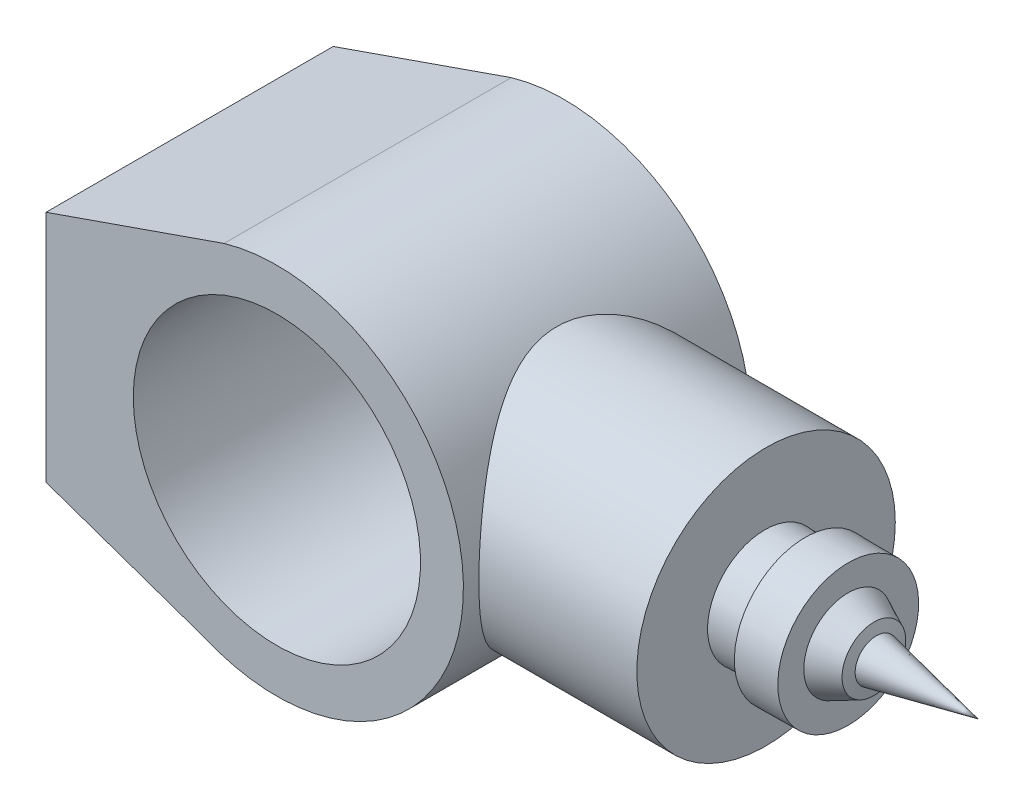
ISO-10303-21;
HEADER;
FILE_DESCRIPTION(('STEP AP214'),'2;1');
FILE_NAME('part.step','',(''),(''),'','','');
FILE_SCHEMA(('AUTOMOTIVE_DESIGN { 1 0 10303 214 1 1 1 1 }'));
ENDSEC;
DATA;
#1=APPLICATION_CONTEXT('core data for automotive mechanical design processes');
#2=APPLICATION_PROTOCOL_DEFINITION('international standard','automotive_design',2000,#1);
#3=PRODUCT_CONTEXT('',#1,'mechanical');
#4=PRODUCT('Part','Part','',(#3));
#5=PRODUCT_RELATED_PRODUCT_CATEGORY('part','',(#4));
#6=PRODUCT_DEFINITION_FORMATION('','',#4);
#7=PRODUCT_DEFINITION_CONTEXT('part definition',#1,'design');
#8=PRODUCT_DEFINITION('design','',#6,#7);
#9=PRODUCT_DEFINITION_SHAPE('','',#8);
#10=(LENGTH_UNIT() NAMED_UNIT(*) SI_UNIT(.MILLI.,.METRE.));
#11=(NAMED_UNIT(*) PLANE_ANGLE_UNIT() SI_UNIT($,.RADIAN.));
#12=(NAMED_UNIT(*) SI_UNIT($,.STERADIAN.) SOLID_ANGLE_UNIT());
#13=UNCERTAINTY_MEASURE_WITH_UNIT(LENGTH_MEASURE(1.E-05),#10,'distance_accuracy_value','');
#14=(GEOMETRIC_REPRESENTATION_CONTEXT(3) GLOBAL_UNCERTAINTY_ASSIGNED_CONTEXT((#13)) GLOBAL_UNIT_ASSIGNED_CONTEXT((#10,
#11,#12)) REPRESENTATION_CONTEXT('',''));
#15=CARTESIAN_POINT('',(0.,0.,0.));
#16=DIRECTION('',(0.,0.,1.));
#17=DIRECTION('',(1.,0.,0.));
#18=AXIS2_PLACEMENT_3D('',#15,#16,#17);
#19=CARTESIAN_POINT('',(0.00618355514686586,0.0594750928781919,50.));
#20=DIRECTION('',(0.,0.,1.));
#21=DIRECTION('',(1.,0.,0.));
#22=AXIS2_PLACEMENT_3D('',#19,#20,#21);
#23=PLANE('',#22);
#24=DIRECTION('',(1.92428249268596E-05,-0.999999999814857,0.));
#25=VECTOR('',#24,1.);
#26=CARTESIAN_POINT('',(-80.3312075230158,-40.5944421761226,50.));
#27=LINE('',#26,#25);
#28=CARTESIAN_POINT('',(-80.3327741028213,40.8166713739245,50.));
#29=VERTEX_POINT('',#28);
#30=CARTESIAN_POINT('',(-80.3312075230158,-40.5944421761226,50.));
#31=VERTEX_POINT('',#30);
#32=EDGE_CURVE('E195',#29,#31,#27,.T.);
#33=ORIENTED_EDGE('',*,*,#32,.T.);
#34=DIRECTION('',(0.944264675238621,-0.32918721587647,0.));
#35=VECTOR('',#34,1.);
#36=CARTESIAN_POINT('',(-80.3312075230158,-40.5944421761226,50.));
#37=LINE('',#36,#35);
#38=CARTESIAN_POINT('',(-25.7187652070605,-59.6332967575042,50.));
#39=VERTEX_POINT('',#38);
#40=EDGE_CURVE('E91',#31,#39,#37,.T.);
#41=ORIENTED_EDGE('',*,*,#40,.T.);
#42=CARTESIAN_POINT('',(0.00618355514686586,0.0594750928781919,50.));
#43=DIRECTION('',(0.,0.,1.));
#44=DIRECTION('',(1.,0.,0.));
#45=AXIS2_PLACEMENT_3D('',#42,#43,#44);
#46=CIRCLE('',#45,65.);
#47=CARTESIAN_POINT('',(-18.3273224096611,62.4203807873784,50.));
#48=VERTEX_POINT('',#47);
#49=EDGE_CURVE('E187',#39,#48,#46,.T.);
#50=ORIENTED_EDGE('',*,*,#49,.T.);
#51=DIRECTION('',(-0.944323729935792,-0.329017770158624,0.));
#52=VECTOR('',#51,1.);
#53=CARTESIAN_POINT('',(-80.3327741028213,40.8166713739245,50.));
#54=LINE('',#53,#52);
#55=EDGE_CURVE('E59',#48,#29,#54,.T.);
#56=ORIENTED_EDGE('',*,*,#55,.T.);
#57=EDGE_LOOP('',(#33,#41,#50,#56));
#58=FACE_BOUND('',#57,.T.);
#59=CARTESIAN_POINT('',(0.0594750928781911,0.332978869949552,50.));
#60=DIRECTION('',(0.,0.,1.));
#61=DIRECTION('',(1.,0.,0.));
#62=AXIS2_PLACEMENT_3D('',#59,#60,#61);
#63=CIRCLE('',#62,50.);
#64=CARTESIAN_POINT('',(-49.9405249071218,0.332978869949552,50.));
#65=VERTEX_POINT('',#64);
#66=EDGE_CURVE('E216',#65,#65,#63,.T.);
#67=ORIENTED_EDGE('',*,*,#66,.F.);
#68=EDGE_LOOP('',(#67));
#69=FACE_BOUND('',#68,.T.);
#70=ADVANCED_FACE('F41',(#58,#69),#23,.T.);
#71=CARTESIAN_POINT('',(0.00618355514686586,0.0594750928781919,-50.));
#72=DIRECTION('',(0.,0.,1.));
#73=DIRECTION('',(1.,0.,0.));
#74=AXIS2_PLACEMENT_3D('',#71,#72,#73);
#75=PLANE('',#74);
#76=DIRECTION('',(1.92428249268596E-05,-0.999999999814857,0.));
#77=VECTOR('',#76,1.);
#78=CARTESIAN_POINT('',(-80.3312075230158,-40.5944421761226,-50.));
#79=LINE('',#78,#77);
#80=CARTESIAN_POINT('',(-80.3327741028213,40.8166713739245,-50.));
#81=VERTEX_POINT('',#80);
#82=CARTESIAN_POINT('',(-80.3312075230158,-40.5944421761226,-50.));
#83=VERTEX_POINT('',#82);
#84=EDGE_CURVE('E185',#81,#83,#79,.T.);
#85=ORIENTED_EDGE('',*,*,#84,.F.);
#86=DIRECTION('',(-0.944323729935792,-0.329017770158624,0.));
#87=VECTOR('',#86,1.);
#88=CARTESIAN_POINT('',(-80.3327741028213,40.8166713739245,-50.));
#89=LINE('',#88,#87);
#90=CARTESIAN_POINT('',(-18.3273224096611,62.4203807873784,-50.));
#91=VERTEX_POINT('',#90);
#92=EDGE_CURVE('E83',#91,#81,#89,.T.);
#93=ORIENTED_EDGE('',*,*,#92,.F.);
#94=CARTESIAN_POINT('',(0.00618355514686586,0.0594750928781919,-50.));
#95=DIRECTION('',(0.,0.,1.));
#96=DIRECTION('',(1.,0.,0.));
#97=AXIS2_PLACEMENT_3D('',#94,#95,#96);
#98=CIRCLE('',#97,65.);
#99=CARTESIAN_POINT('',(-25.7187652070605,-59.6332967575042,-50.));
#100=VERTEX_POINT('',#99);
#101=EDGE_CURVE('E77',#100,#91,#98,.T.);
#102=ORIENTED_EDGE('',*,*,#101,.F.);
#103=DIRECTION('',(0.944264675238621,-0.32918721587647,0.));
#104=VECTOR('',#103,1.);
#105=CARTESIAN_POINT('',(-80.3312075230158,-40.5944421761226,-50.));
#106=LINE('',#105,#104);
#107=EDGE_CURVE('E178',#83,#100,#106,.T.);
#108=ORIENTED_EDGE('',*,*,#107,.F.);
#109=EDGE_LOOP('',(#85,#93,#102,#108));
#110=FACE_BOUND('',#109,.T.);
#111=CARTESIAN_POINT('',(0.0594750928781911,0.332978869949552,-50.));
#112=DIRECTION('',(0.,0.,1.));
#113=DIRECTION('',(1.,0.,0.));
#114=AXIS2_PLACEMENT_3D('',#111,#112,#113);
#115=CIRCLE('',#114,50.);
#116=CARTESIAN_POINT('',(-49.9405249071218,0.332978869949552,-50.));
#117=VERTEX_POINT('',#116);
#118=EDGE_CURVE('E214',#117,#117,#115,.T.);
#119=ORIENTED_EDGE('',*,*,#118,.T.);
#120=EDGE_LOOP('',(#119));
#121=FACE_BOUND('',#120,.T.);
#122=ADVANCED_FACE('F158',(#110,#121),#75,.F.);
#123=CARTESIAN_POINT('',(-80.3312075230158,-40.5944421761226,50.));
#124=DIRECTION('',(0.999999999814857,1.92428249268596E-05,0.));
#125=DIRECTION('',(-1.92428249268596E-05,0.999999999814857,0.));
#126=AXIS2_PLACEMENT_3D('',#123,#124,#125);
#127=PLANE('',#126);
#128=ORIENTED_EDGE('',*,*,#84,.T.);
#129=DIRECTION('',(0.,0.,-1.));
#130=VECTOR('',#129,1.);
#131=CARTESIAN_POINT('',(-80.3312075230158,-40.5944421761226,50.));
#132=LINE('',#131,#130);
#133=EDGE_CURVE('E51',#31,#83,#132,.T.);
#134=ORIENTED_EDGE('',*,*,#133,.F.);
#135=ORIENTED_EDGE('',*,*,#32,.F.);
#136=DIRECTION('',(0.,0.,-1.));
#137=VECTOR('',#136,1.);
#138=CARTESIAN_POINT('',(-80.3327741028213,40.8166713739245,50.));
#139=LINE('',#138,#137);
#140=EDGE_CURVE('E199',#29,#81,#139,.T.);
#141=ORIENTED_EDGE('',*,*,#140,.T.);
#142=EDGE_LOOP('',(#128,#134,#135,#141));
#143=FACE_BOUND('',#142,.T.);
#144=ADVANCED_FACE('F43',(#143),#127,.F.);
#145=CARTESIAN_POINT('',(-80.3312075230158,-40.5944421761226,50.));
#146=DIRECTION('',(0.32918721587647,0.944264675238621,0.));
#147=DIRECTION('',(-0.944264675238621,0.32918721587647,0.));
#148=AXIS2_PLACEMENT_3D('',#145,#146,#147);
#149=PLANE('',#148);
#150=ORIENTED_EDGE('',*,*,#107,.T.);
#151=DIRECTION('',(0.,0.,-1.));
#152=VECTOR('',#151,1.);
#153=CARTESIAN_POINT('',(-25.7187652070605,-59.6332967575042,50.));
#154=LINE('',#153,#152);
#155=EDGE_CURVE('E179',#39,#100,#154,.T.);
#156=ORIENTED_EDGE('',*,*,#155,.F.);
#157=ORIENTED_EDGE('',*,*,#40,.F.);
#158=ORIENTED_EDGE('',*,*,#133,.T.);
#159=EDGE_LOOP('',(#150,#156,#157,#158));
#160=FACE_BOUND('',#159,.T.);
#161=ADVANCED_FACE('F171',(#160),#149,.F.);
#162=CARTESIAN_POINT('',(0.00618355514686586,0.0594750928781919,50.));
#163=DIRECTION('',(0.,0.,-1.));
#164=DIRECTION('',(-1.,0.,0.));
#165=AXIS2_PLACEMENT_3D('',#162,#163,#164);
#166=CYLINDRICAL_SURFACE('',#165,65.);
#167=CARTESIAN_POINT('',(65.0059049338752,-0.130842241312512,-45.3806346683828));
#168=CARTESIAN_POINT('',(65.0091872553768,0.989658929265493,-45.3806362425109));
#169=CARTESIAN_POINT('',(64.9834330422538,2.11022352091203,-45.3387279536637));
#170=CARTESIAN_POINT('',(64.874558193947,4.34227980312107,-45.1717457366691));
#171=CARTESIAN_POINT('',(64.7914392069566,5.45377175342858,-45.0466741979558));
#172=CARTESIAN_POINT('',(64.5698851877234,7.65930209230564,-44.7152459223202));
#173=CARTESIAN_POINT('',(64.43143154508,8.75333447993078,-44.5088618383284));
#174=CARTESIAN_POINT('',(64.1025136298247,10.9156533475492,-44.0178238153161));
#175=CARTESIAN_POINT('',(63.9120482848828,11.9839392962315,-43.7331682625647));
#176=CARTESIAN_POINT('',(63.4844444336006,14.0827385119529,-43.0909697604663));
#177=CARTESIAN_POINT('',(63.2475392880034,15.1134112657456,-42.7337909329793));
#178=CARTESIAN_POINT('',(62.7313938927494,17.1368979391379,-41.9498846280055));
#179=CARTESIAN_POINT('',(62.4521539323194,18.1297121173252,-41.5231576256627));
#180=CARTESIAN_POINT('',(61.8567194985274,20.0730734396859,-40.6044717421547));
#181=CARTESIAN_POINT('',(61.5405250779478,21.023620644227,-40.1125129541607));
#182=CARTESIAN_POINT('',(60.876838779645,22.8790796243232,-39.0675495355798));
#183=CARTESIAN_POINT('',(60.5293453759693,23.7839891714984,-38.5145419283181));
#184=CARTESIAN_POINT('',(59.777653425543,25.621961076902,-37.3009374000212));
#185=CARTESIAN_POINT('',(59.3711505241239,26.5506653936938,-36.6351696753496));
#186=CARTESIAN_POINT('',(58.5357126975698,28.3486442894085,-35.2405477199723));
#187=CARTESIAN_POINT('',(58.1067767313236,29.2179161057612,-34.5116905602765));
#188=CARTESIAN_POINT('',(57.2337157633662,30.8962296938965,-32.993560678793));
#189=CARTESIAN_POINT('',(56.7895709459726,31.705188159453,-32.2042073401365));
#190=CARTESIAN_POINT('',(55.8948049972388,33.2598754455241,-30.5689264576716));
#191=CARTESIAN_POINT('',(55.4441834885361,34.0056005641576,-29.7229956068143));
#192=CARTESIAN_POINT('',(54.4680510037555,35.5542586866264,-27.8272635665521));
#193=CARTESIAN_POINT('',(53.9429305284391,36.3451186317261,-26.7673579793293));
#194=CARTESIAN_POINT('',(52.910633350932,37.8343383938985,-24.5756911905927));
#195=CARTESIAN_POINT('',(52.4034611241167,38.5326752579029,-23.4439122614152));
#196=CARTESIAN_POINT('',(51.4248046211996,39.8311417995961,-21.112682285545));
#197=CARTESIAN_POINT('',(50.9532751156264,40.431397103404,-19.9133204931997));
#198=CARTESIAN_POINT('',(50.064489975515,41.5283105235476,-17.4490783518282));
#199=CARTESIAN_POINT('',(49.6472069221296,42.0250210537789,-16.1842315577864));
#200=CARTESIAN_POINT('',(49.002801848099,42.7735986427547,-13.986486951409));
#201=CARTESIAN_POINT('',(48.7563417114231,43.0540773136988,-13.0689270097847));
#202=CARTESIAN_POINT('',(48.3073571204122,43.5578726526489,-11.2076913096422));
#203=CARTESIAN_POINT('',(48.1048255800007,43.7811985409583,-10.2640197908888));
#204=CARTESIAN_POINT('',(47.7509504858423,44.1673648695111,-8.35648160004781));
#205=CARTESIAN_POINT('',(47.5995244387394,44.3303028287536,-7.39265016685733));
#206=CARTESIAN_POINT('',(47.3532980446815,44.5935454982247,-5.44921259373885));
#207=CARTESIAN_POINT('',(47.2584976826182,44.6938502251644,-4.46960645801976));
#208=CARTESIAN_POINT('',(47.129225409609,44.830313372151,-2.49662145935127));
#209=CARTESIAN_POINT('',(47.0950790236964,44.8661256806496,-1.50319694817031));
#210=CARTESIAN_POINT('',(47.0896598099643,44.8718202816496,0.484013328943253));
#211=CARTESIAN_POINT('',(47.1183868779792,44.8417026833805,1.47779909427462));
#212=CARTESIAN_POINT('',(47.2374444332955,44.7161135640964,3.45806147079674));
#213=CARTESIAN_POINT('',(47.3278122285193,44.6206024636682,4.44453328951142));
#214=CARTESIAN_POINT('',(47.5662730950315,44.3659995942826,6.40209768270784));
#215=CARTESIAN_POINT('',(47.7143673978445,44.2069064688783,7.37318992862518));
#216=CARTESIAN_POINT('',(48.0518195873801,43.8393219603993,9.235514926146));
#217=CARTESIAN_POINT('',(48.2381291593237,43.6344128662625,10.1280184758552));
#218=CARTESIAN_POINT('',(48.6507446378486,43.1733050591729,11.8905094756267));
#219=CARTESIAN_POINT('',(48.8770653287124,42.9170873828148,12.7604884660682));
#220=CARTESIAN_POINT('',(49.3636298200253,42.3558149757796,14.4752858666811));
#221=CARTESIAN_POINT('',(49.6238916655855,42.0507342468088,15.3200905971227));
#222=CARTESIAN_POINT('',(50.172057087785,41.3943032974769,16.9819836278503));
#223=CARTESIAN_POINT('',(50.4599562353505,41.0429604875999,17.799076340875));
#224=CARTESIAN_POINT('',(51.2095303510216,40.1061612576732,19.8126021393299));
#225=CARTESIAN_POINT('',(51.6851685596079,39.4924631676707,20.9908077919223));
#226=CARTESIAN_POINT('',(52.6678940148657,38.1701474326866,23.2790702760202));
#227=CARTESIAN_POINT('',(53.1749934184335,37.4614929714659,24.3891004300257));
#228=CARTESIAN_POINT('',(54.2052306364195,35.9523635692983,26.5401966761436));
#229=CARTESIAN_POINT('',(54.7283945851027,35.1517324909203,27.5811406196633));
#230=CARTESIAN_POINT('',(55.7752686099193,33.463009460618,29.5889104299042));
#231=CARTESIAN_POINT('',(56.2989786115367,32.5749282040576,30.5557453346781));
#232=CARTESIAN_POINT('',(57.3389494598868,30.7043894231943,32.4210526680026));
#233=CARTESIAN_POINT('',(57.8550792394748,29.7210591412479,33.3187243017967));
#234=CARTESIAN_POINT('',(58.861361303266,27.6705655437326,35.029310669788));
#235=CARTESIAN_POINT('',(59.3515112318076,26.6033946478167,35.8422177245997));
#236=CARTESIAN_POINT('',(60.2923511410904,24.3909459123217,37.3750226763356));
#237=CARTESIAN_POINT('',(60.7431105728095,23.2458121471314,38.0950853825893));
#238=CARTESIAN_POINT('',(61.5938585433119,20.8809980739804,39.4358003072715));
#239=CARTESIAN_POINT('',(61.9938623832733,19.66134039764,40.0564825005743));
#240=CARTESIAN_POINT('',(62.649408462854,17.4335712306124,41.0637354161479));
#241=CARTESIAN_POINT('',(62.9172977500441,16.4387018353193,41.471677112149));
#242=CARTESIAN_POINT('',(63.4101690807553,14.4128952061897,42.2180080331738));
#243=CARTESIAN_POINT('',(63.6351571098738,13.381963027632,42.5564069613398));
#244=CARTESIAN_POINT('',(64.0374616903181,11.2901975147412,43.1595078178244));
#245=CARTESIAN_POINT('',(64.2148022944863,10.2293795669652,43.4242469326796));
#246=CARTESIAN_POINT('',(64.5180297166082,8.08412792909262,43.8767471749536));
#247=CARTESIAN_POINT('',(64.6439154241407,6.99969372987809,44.0645066411151));
#248=CARTESIAN_POINT('',(64.8416295671284,4.81097255407412,44.3608730412299));
#249=CARTESIAN_POINT('',(64.9132540223095,3.7066264870725,44.4691812521487));
#250=CARTESIAN_POINT('',(64.9998826782701,1.49071516173145,44.6038359262945));
#251=CARTESIAN_POINT('',(65.014886910414,0.37914990739139,44.6301824349236));
#252=CARTESIAN_POINT('',(64.9878540825245,-1.8421914621133,44.6005297666603));
#253=CARTESIAN_POINT('',(64.9458162263714,-2.95196755209066,44.5445294404762));
#254=CARTESIAN_POINT('',(64.8056705326611,-5.16077909656408,44.3511073865771));
#255=CARTESIAN_POINT('',(64.7075643529903,-6.25981486766375,44.2136880663389));
#256=CARTESIAN_POINT('',(64.4649567487981,-8.37449728122801,43.8700299000515));
#257=CARTESIAN_POINT('',(64.32353037053,-9.39124115382521,43.6683242168367));
#258=CARTESIAN_POINT('',(63.9958962779658,-11.4014913440654,43.1973205047849));
#259=CARTESIAN_POINT('',(63.8096907082978,-12.3949987720812,42.9280257129938));
#260=CARTESIAN_POINT('',(63.3960050181177,-14.3534505382044,42.3249554504748));
#261=CARTESIAN_POINT('',(63.1685215632109,-15.3183925614913,41.9911747704871));
#262=CARTESIAN_POINT('',(62.6763330987763,-17.2151468450645,41.2625984731645));
#263=CARTESIAN_POINT('',(62.4116260008951,-18.1469572428941,40.8677994324008));
#264=CARTESIAN_POINT('',(61.8278641416185,-20.0437159794013,39.9883175693059));
#265=CARTESIAN_POINT('',(61.5062003941825,-21.0057420545971,39.4990679890817));
#266=CARTESIAN_POINT('',(60.8306112416292,-22.8836055174872,38.4583200139032));
#267=CARTESIAN_POINT('',(60.476684527276,-23.7994410284172,37.9068190925641));
#268=CARTESIAN_POINT('',(59.7423241715317,-25.5827534025115,36.7452757895626));
#269=CARTESIAN_POINT('',(59.3618762657748,-26.4502037832604,36.1352018369305));
#270=CARTESIAN_POINT('',(58.5807225341059,-28.1342321570875,34.8603311106955));
#271=CARTESIAN_POINT('',(58.1800156235703,-28.9508074211861,34.1955314059942));
#272=CARTESIAN_POINT('',(57.2947858910147,-30.6667411504291,32.6960901252525));
#273=CARTESIAN_POINT('',(56.8076479247612,-31.5563769365835,31.8518453279193));
#274=CARTESIAN_POINT('',(55.8243791860864,-33.2616591138599,30.0963540968743));
#275=CARTESIAN_POINT('',(55.3282470700566,-34.0772943391447,29.1850975892957));
#276=CARTESIAN_POINT('',(54.3376899091745,-35.632793956469,27.2980145321878));
#277=CARTESIAN_POINT('',(53.8432661861985,-36.3726086658543,26.3221463253588));
#278=CARTESIAN_POINT('',(52.8684715531349,-37.7731320015265,24.308667791895));
#279=CARTESIAN_POINT('',(52.3880987298302,-38.433851435935,23.2710659300448));
#280=CARTESIAN_POINT('',(51.5103134802846,-39.598961630383,21.2630637827351));
#281=CARTESIAN_POINT('',(51.1098327812989,-40.112599010582,20.2993683231887));
#282=CARTESIAN_POINT('',(50.3403021669427,-41.0726896608711,18.3268005037178));
#283=CARTESIAN_POINT('',(49.9712524204642,-41.51914256996,17.3179279010817));
#284=CARTESIAN_POINT('',(49.2764056537584,-42.3402200848085,15.2588922052344));
#285=CARTESIAN_POINT('',(48.9505391660273,-42.714960494297,14.2087990388435));
#286=CARTESIAN_POINT('',(48.3533718976856,-43.3887979009461,12.0695016434814));
#287=CARTESIAN_POINT('',(48.0820578287826,-43.6879133239962,10.9803070155109));
#288=CARTESIAN_POINT('',(47.6506163785293,-44.1569198229173,8.97647065274578));
#289=CARTESIAN_POINT('',(47.4791769401771,-44.3405300128283,8.06746579154596));
#290=CARTESIAN_POINT('',(47.1858929018862,-44.6520558985879,6.23204611743766));
#291=CARTESIAN_POINT('',(47.0640421497564,-44.7799785034211,5.3056334791434));
#292=CARTESIAN_POINT('',(46.874591640175,-44.977967270677,3.44199910956193));
#293=CARTESIAN_POINT('',(46.8069394396984,-45.0480893633187,2.50478871940329));
#294=CARTESIAN_POINT('',(46.7284106838423,-45.1294257654984,0.625394012549554));
#295=CARTESIAN_POINT('',(46.7175349180657,-45.1406392557809,-0.316790373137639));
#296=CARTESIAN_POINT('',(46.7530230492318,-45.1039350675642,-2.19933967660787));
#297=CARTESIAN_POINT('',(46.7994129939436,-45.055990480542,-3.13970357140851));
#298=CARTESIAN_POINT('',(46.9475713291468,-44.9018129185848,-5.01117003876365));
#299=CARTESIAN_POINT('',(47.049339398018,-44.7955802821701,-5.94227266507295));
#300=CARTESIAN_POINT('',(47.3044745099935,-44.5264635770272,-7.79021054360754));
#301=CARTESIAN_POINT('',(47.4579055800034,-44.3635092035091,-8.70702660783189));
#302=CARTESIAN_POINT('',(47.8109195273977,-43.9833939657268,-10.5202723249432));
#303=CARTESIAN_POINT('',(48.0105085976477,-43.7662258274709,-11.4166992245422));
#304=CARTESIAN_POINT('',(48.5158000518008,-43.2071244154997,-13.4518969357539));
#305=CARTESIAN_POINT('',(48.8353569680084,-42.8473135991101,-14.5823410244612));
#306=CARTESIAN_POINT('',(49.5278853497447,-42.0461196997051,-16.797012723085));
#307=CARTESIAN_POINT('',(49.9008736555046,-41.6047108862645,-17.8812256217598));
#308=CARTESIAN_POINT('',(50.6869981820807,-40.6448271327374,-20.0013566556098));
#309=CARTESIAN_POINT('',(51.1001813318101,-40.1262617265074,-21.0372161978264));
#310=CARTESIAN_POINT('',(51.9537949419807,-39.0165492413253,-23.0572723180792));
#311=CARTESIAN_POINT('',(52.3942236694785,-38.425406776256,-24.0414721745622));
#312=CARTESIAN_POINT('',(53.3014881095076,-37.1592160921703,-25.9788637925415));
#313=CARTESIAN_POINT('',(53.7686981855583,-36.4825508505571,-26.9308218544135));
#314=CARTESIAN_POINT('',(54.7091873474462,-35.0590272433509,-28.7774834967824));
#315=CARTESIAN_POINT('',(55.1824664239436,-34.3121689857698,-29.6721871653781));
#316=CARTESIAN_POINT('',(56.1254263222107,-32.7500238190374,-31.4023650198615));
#317=CARTESIAN_POINT('',(56.5951060155943,-31.9347163379575,-32.2378212591848));
#318=CARTESIAN_POINT('',(57.521570219416,-30.2376381601133,-33.8462537294745));
#319=CARTESIAN_POINT('',(57.9783534908051,-29.3558611068216,-34.6192239701795));
#320=CARTESIAN_POINT('',(58.9439020677931,-27.3768039139856,-36.2210443954424));
#321=CARTESIAN_POINT('',(59.4487928909531,-26.2679840774717,-37.0380392061578));
#322=CARTESIAN_POINT('',(60.415729517402,-23.9664258045731,-38.5745942852669));
#323=CARTESIAN_POINT('',(60.8777686029698,-22.773674261872,-39.2941392848956));
#324=CARTESIAN_POINT('',(61.5283433337291,-20.9274223857237,-40.2929342550778));
#325=CARTESIAN_POINT('',(61.7380451046523,-20.3027470844758,-40.6123331790878));
#326=CARTESIAN_POINT('',(62.1418479242715,-19.0350641639752,-41.2233237103234));
#327=CARTESIAN_POINT('',(62.335951215834,-18.3920591983768,-41.5149193164477));
#328=CARTESIAN_POINT('',(62.7069827818564,-17.088953311029,-42.0690457830521));
#329=CARTESIAN_POINT('',(62.8839146556343,-16.4288560089294,-42.3315827361736));
#330=CARTESIAN_POINT('',(63.2191612275465,-15.0928821847421,-42.8264225680568));
#331=CARTESIAN_POINT('',(63.3774772541079,-14.4170067927095,-43.0587276042952));
#332=CARTESIAN_POINT('',(63.7610500151171,-12.6505518852215,-43.6189008462752));
#333=CARTESIAN_POINT('',(63.9711890377592,-11.5489846279763,-43.9230264293396));
#334=CARTESIAN_POINT('',(64.336213471643,-9.31739081869676,-44.4478697200319));
#335=CARTESIAN_POINT('',(64.4911070953094,-8.18736852336526,-44.6685998249833));
#336=CARTESIAN_POINT('',(64.7418063995523,-5.90812441643176,-45.0231240524536));
#337=CARTESIAN_POINT('',(64.8376582009205,-4.75891831300187,-45.1569860367919));
#338=CARTESIAN_POINT('',(64.9680088481271,-2.45011151015628,-45.3357403968069));
#339=CARTESIAN_POINT('',(65.0025078779127,-1.29051084191595,-45.3806330392307));
#340=CARTESIAN_POINT('',(65.0059049338752,-0.130842241312512,-45.3806346683828));
#341=B_SPLINE_CURVE_WITH_KNOTS('',3,(#167,#168,#169,#170,#171,#172,#173,#174,#175,#176,#177,
#178,#179,#180,#181,#182,#183,#184,#185,#186,#187,#188,#189,#190,#191,#192,#193,#194,#195,#196,
#197,#198,#199,#200,#201,#202,#203,#204,#205,#206,#207,#208,#209,#210,#211,#212,#213,#214,#215,
#216,#217,#218,#219,#220,#221,#222,#223,#224,#225,#226,#227,#228,#229,#230,#231,#232,#233,#234,
#235,#236,#237,#238,#239,#240,#241,#242,#243,#244,#245,#246,#247,#248,#249,#250,#251,#252,#253,
#254,#255,#256,#257,#258,#259,#260,#261,#262,#263,#264,#265,#266,#267,#268,#269,#270,#271,#272,
#273,#274,#275,#276,#277,#278,#279,#280,#281,#282,#283,#284,#285,#286,#287,#288,#289,#290,#291,
#292,#293,#294,#295,#296,#297,#298,#299,#300,#301,#302,#303,#304,#305,#306,#307,#308,#309,#310,
#311,#312,#313,#314,#315,#316,#317,#318,#319,#320,#321,#322,#323,#324,#325,#326,#327,#328,#329,
#330,#331,#332,#333,#334,#335,#336,#337,#338,#339,#340),.UNSPECIFIED.,.T.,.F.,(4,2,2,2,2,2,2,2,
2,2,2,2,2,2,2,2,2,2,2,2,2,2,2,2,2,2,2,2,2,2,2,2,2,2,2,2,2,2,2,2,2,2,2,2,2,2,2,2,2,2,2,2,2,2,2,2,
2,2,2,2,2,2,2,2,2,2,2,2,2,2,2,2,2,2,2,2,2,2,2,2,2,2,2,2,2,2,4),(0.,3.36033141193152,
6.72056627949205,10.0819322286866,13.4433674847035,16.7883255322417,20.1332607284264,
23.4781911470641,26.8232847330093,30.4583143841555,34.0935128858007,37.7336428031522,
41.3739856783618,45.6377437870073,49.9025576734068,54.1618654839493,58.4190119884878,
61.3882631065476,64.3570349009777,67.3209913899404,70.2849470880914,73.2647625775457,
76.2445731301912,79.2261888091714,82.2078681007684,85.0086619780159,87.810492932108,
90.6138196236508,93.416697809796,97.6438739928338,101.872693893811,106.108801686047,
110.344392034219,114.623325183592,118.902645653705,123.174262080311,127.444587676898,
130.765663340606,134.086275307186,137.405207836433,140.724211986044,144.055631941111,
147.387050050756,150.718514656508,154.049880759153,157.184913550826,160.319796224987,
163.4549322453,166.590244225988,169.965525824754,173.340944453957,176.71819276448,
180.095622077457,184.050611210322,188.006196116726,191.96435663273,195.921975659606,
199.408454586546,202.894952246653,206.375771385557,209.855741610172,212.68212482605,
215.50815728139,218.331451927386,221.154785837486,223.979404437062,226.804006632242,
229.632122372425,232.460617771856,236.141013888596,239.822572536268,243.508482335141,
247.194157933859,250.964597872905,254.735032010148,258.506603409237,262.278535944784,
266.673432497809,271.069016863346,273.265043020169,275.46075284875,277.656001433818,
279.851093270709,283.332136402007,286.812661848,290.290465006068,293.768257737001),.UNSPECIFIED.);
#342=CARTESIAN_POINT('',(65.0059049338752,-0.130842241312512,-45.3806346683828));
#343=VERTEX_POINT('',#342);
#344=EDGE_CURVE('E129',#343,#343,#341,.T.);
#345=ORIENTED_EDGE('',*,*,#344,.F.);
#346=EDGE_LOOP('',(#345));
#347=FACE_BOUND('',#346,.T.);
#348=ORIENTED_EDGE('',*,*,#101,.T.);
#349=DIRECTION('',(0.,0.,-1.));
#350=VECTOR('',#349,1.);
#351=CARTESIAN_POINT('',(-18.3273224096611,62.4203807873784,50.));
#352=LINE('',#351,#350);
#353=EDGE_CURVE('E189',#48,#91,#352,.T.);
#354=ORIENTED_EDGE('',*,*,#353,.F.);
#355=ORIENTED_EDGE('',*,*,#49,.F.);
#356=ORIENTED_EDGE('',*,*,#155,.T.);
#357=EDGE_LOOP('',(#348,#354,#355,#356));
#358=FACE_BOUND('',#357,.T.);
#359=ADVANCED_FACE('F169',(#347,#358),#166,.T.);
#360=CARTESIAN_POINT('',(-80.3327741028213,40.8166713739245,50.));
#361=DIRECTION('',(0.329017770158624,-0.944323729935792,0.));
#362=DIRECTION('',(0.944323729935792,0.329017770158624,0.));
#363=AXIS2_PLACEMENT_3D('',#360,#361,#362);
#364=PLANE('',#363);
#365=ORIENTED_EDGE('',*,*,#92,.T.);
#366=ORIENTED_EDGE('',*,*,#140,.F.);
#367=ORIENTED_EDGE('',*,*,#55,.F.);
#368=ORIENTED_EDGE('',*,*,#353,.T.);
#369=EDGE_LOOP('',(#365,#366,#367,#368));
#370=FACE_BOUND('',#369,.T.);
#371=ADVANCED_FACE('F155',(#370),#364,.F.);
#372=CARTESIAN_POINT('',(0.0594750928781911,0.332978869949552,50.));
#373=DIRECTION('',(0.,0.,-1.));
#374=DIRECTION('',(-1.,0.,0.));
#375=AXIS2_PLACEMENT_3D('',#372,#373,#374);
#376=CYLINDRICAL_SURFACE('',#375,50.);
#377=CARTESIAN_POINT('',(-49.9405249071218,0.332978869949552,50.));
#378=CARTESIAN_POINT('',(-49.9405249071218,0.332978869949552,48.9583333333333));
#379=CARTESIAN_POINT('',(-49.9405249071218,0.332978869949552,47.9166666666667));
#380=CARTESIAN_POINT('',(-49.9405249071218,0.332978869949552,45.8333333333333));
#381=CARTESIAN_POINT('',(-49.9405249071218,0.332978869949552,44.7916666666667));
#382=CARTESIAN_POINT('',(-49.9405249071218,0.332978869949552,42.7083333333333));
#383=CARTESIAN_POINT('',(-49.9405249071218,0.332978869949552,41.6666666666667));
#384=CARTESIAN_POINT('',(-49.9405249071218,0.332978869949552,39.5833333333333));
#385=CARTESIAN_POINT('',(-49.9405249071218,0.332978869949552,38.5416666666667));
#386=CARTESIAN_POINT('',(-49.9405249071218,0.332978869949552,36.4583333333333));
#387=CARTESIAN_POINT('',(-49.9405249071218,0.332978869949552,35.4166666666667));
#388=CARTESIAN_POINT('',(-49.9405249071218,0.332978869949552,33.3333333333333));
#389=CARTESIAN_POINT('',(-49.9405249071218,0.332978869949552,32.2916666666667));
#390=CARTESIAN_POINT('',(-49.9405249071218,0.332978869949552,30.2083333333333));
#391=CARTESIAN_POINT('',(-49.9405249071218,0.332978869949552,29.1666666666667));
#392=CARTESIAN_POINT('',(-49.9405249071218,0.332978869949552,27.0833333333333));
#393=CARTESIAN_POINT('',(-49.9405249071218,0.332978869949552,26.0416666666667));
#394=CARTESIAN_POINT('',(-49.9405249071218,0.332978869949552,23.9583333333333));
#395=CARTESIAN_POINT('',(-49.9405249071218,0.332978869949552,22.9166666666667));
#396=CARTESIAN_POINT('',(-49.9405249071218,0.332978869949552,20.8333333333333));
#397=CARTESIAN_POINT('',(-49.9405249071218,0.332978869949552,19.7916666666667));
#398=CARTESIAN_POINT('',(-49.9405249071218,0.332978869949552,17.7083333333333));
#399=CARTESIAN_POINT('',(-49.9405249071218,0.332978869949552,16.6666666666667));
#400=CARTESIAN_POINT('',(-49.9405249071218,0.332978869949552,14.5833333333333));
#401=CARTESIAN_POINT('',(-49.9405249071218,0.332978869949552,13.5416666666667));
#402=CARTESIAN_POINT('',(-49.9405249071218,0.332978869949552,11.4583333333333));
#403=CARTESIAN_POINT('',(-49.9405249071218,0.332978869949552,10.4166666666667));
#404=CARTESIAN_POINT('',(-49.9405249071218,0.332978869949552,8.33333333333333));
#405=CARTESIAN_POINT('',(-49.9405249071218,0.332978869949552,7.29166666666666));
#406=CARTESIAN_POINT('',(-49.9405249071218,0.332978869949552,5.20833333333333));
#407=CARTESIAN_POINT('',(-49.9405249071218,0.332978869949552,4.16666666666666));
#408=CARTESIAN_POINT('',(-49.9405249071218,0.332978869949552,2.08333333333333));
#409=CARTESIAN_POINT('',(-49.9405249071218,0.332978869949552,1.04166666666666));
#410=CARTESIAN_POINT('',(-49.9405249071218,0.332978869949552,-1.04166666666667));
#411=CARTESIAN_POINT('',(-49.9405249071218,0.332978869949552,-2.08333333333334));
#412=CARTESIAN_POINT('',(-49.9405249071218,0.332978869949552,-4.16666666666667));
#413=CARTESIAN_POINT('',(-49.9405249071218,0.332978869949552,-5.20833333333334));
#414=CARTESIAN_POINT('',(-49.9405249071218,0.332978869949552,-7.29166666666667));
#415=CARTESIAN_POINT('',(-49.9405249071218,0.332978869949552,-8.33333333333334));
#416=CARTESIAN_POINT('',(-49.9405249071218,0.332978869949552,-10.4166666666667));
#417=CARTESIAN_POINT('',(-49.9405249071218,0.332978869949552,-11.4583333333333));
#418=CARTESIAN_POINT('',(-49.9405249071218,0.332978869949552,-13.5416666666667));
#419=CARTESIAN_POINT('',(-49.9405249071218,0.332978869949552,-14.5833333333333));
#420=CARTESIAN_POINT('',(-49.9405249071218,0.332978869949552,-16.6666666666667));
#421=CARTESIAN_POINT('',(-49.9405249071218,0.332978869949552,-17.7083333333333));
#422=CARTESIAN_POINT('',(-49.9405249071218,0.332978869949552,-19.7916666666667));
#423=CARTESIAN_POINT('',(-49.9405249071218,0.332978869949552,-20.8333333333333));
#424=CARTESIAN_POINT('',(-49.9405249071218,0.332978869949552,-22.9166666666667));
#425=CARTESIAN_POINT('',(-49.9405249071218,0.332978869949552,-23.9583333333333));
#426=CARTESIAN_POINT('',(-49.9405249071218,0.332978869949552,-26.0416666666667));
#427=CARTESIAN_POINT('',(-49.9405249071218,0.332978869949552,-27.0833333333333));
#428=CARTESIAN_POINT('',(-49.9405249071218,0.332978869949552,-29.1666666666667));
#429=CARTESIAN_POINT('',(-49.9405249071218,0.332978869949552,-30.2083333333333));
#430=CARTESIAN_POINT('',(-49.9405249071218,0.332978869949552,-32.2916666666667));
#431=CARTESIAN_POINT('',(-49.9405249071218,0.332978869949552,-33.3333333333333));
#432=CARTESIAN_POINT('',(-49.9405249071218,0.332978869949552,-35.4166666666667));
#433=CARTESIAN_POINT('',(-49.9405249071218,0.332978869949552,-36.4583333333333));
#434=CARTESIAN_POINT('',(-49.9405249071218,0.332978869949552,-38.5416666666667));
#435=CARTESIAN_POINT('',(-49.9405249071218,0.332978869949552,-39.5833333333333));
#436=CARTESIAN_POINT('',(-49.9405249071218,0.332978869949552,-41.6666666666667));
#437=CARTESIAN_POINT('',(-49.9405249071218,0.332978869949552,-42.7083333333333));
#438=CARTESIAN_POINT('',(-49.9405249071218,0.332978869949552,-44.7916666666667));
#439=CARTESIAN_POINT('',(-49.9405249071218,0.332978869949552,-45.8333333333333));
#440=CARTESIAN_POINT('',(-49.9405249071218,0.332978869949552,-47.9166666666667));
#441=CARTESIAN_POINT('',(-49.9405249071218,0.332978869949552,-48.9583333333333));
#442=CARTESIAN_POINT('',(-49.9405249071218,0.332978869949552,-50.));
#443=B_SPLINE_CURVE_WITH_KNOTS('',3,(#377,#378,#379,#380,#381,#382,#383,#384,#385,#386,#387,
#388,#389,#390,#391,#392,#393,#394,#395,#396,#397,#398,#399,#400,#401,#402,#403,#404,#405,#406,
#407,#408,#409,#410,#411,#412,#413,#414,#415,#416,#417,#418,#419,#420,#421,#422,#423,#424,#425,
#426,#427,#428,#429,#430,#431,#432,#433,#434,#435,#436,#437,#438,#439,#440,#441,#442),
.UNSPECIFIED.,.F.,.F.,(4,2,2,2,2,2,2,2,2,2,2,2,2,2,2,2,2,2,2,2,2,2,2,2,2,2,2,2,2,2,2,2,4),(0.,
3.125,6.25,9.37499999999999,12.5,15.625,18.75,21.875,25.,28.125,31.25,34.375,37.5,40.625,43.75,
46.875,50.,53.125,56.25,59.375,62.5,65.625,68.75,71.875,75.,78.125,81.25,84.375,87.5,90.625,
93.75,96.875,100.),.UNSPECIFIED.);
#444=EDGE_CURVE('BSEAM147',#65,#117,#443,.T.);
#445=ORIENTED_EDGE('',*,*,#66,.T.);
#446=ORIENTED_EDGE('',*,*,#118,.F.);
#447=ORIENTED_EDGE('',*,*,#444,.T.);
#448=ORIENTED_EDGE('',*,*,#444,.F.);
#449=EDGE_LOOP('',(#445,#447,#446,#448));
#450=FACE_BOUND('',#449,.T.);
#451=ADVANCED_FACE('F147',(#450),#376,.F.);
#452=CARTESIAN_POINT('',(-80.3347741028213,-0.130842241312512,-0.380634668382812));
#453=DIRECTION('',(1.,0.,0.));
#454=DIRECTION('',(0.,0.,-1.));
#455=AXIS2_PLACEMENT_3D('',#452,#453,#454);
#456=CYLINDRICAL_SURFACE('',#455,45.);
#457=CARTESIAN_POINT('',(120.,-0.130842241312512,-0.380634668382812));
#458=DIRECTION('',(1.,0.,0.));
#459=DIRECTION('',(0.,0.,-1.));
#460=AXIS2_PLACEMENT_3D('',#457,#458,#459);
#461=CIRCLE('',#460,45.);
#462=CARTESIAN_POINT('',(120.,-0.130842241312512,-45.3806346683828));
#463=VERTEX_POINT('',#462);
#464=EDGE_CURVE('E138',#463,#463,#461,.T.);
#465=ORIENTED_EDGE('',*,*,#464,.F.);
#466=EDGE_LOOP('',(#465));
#467=FACE_BOUND('',#466,.T.);
#468=ORIENTED_EDGE('',*,*,#344,.T.);
#469=EDGE_LOOP('',(#468));
#470=FACE_BOUND('',#469,.T.);
#471=ADVANCED_FACE('F101',(#467,#470),#456,.T.);
#472=CARTESIAN_POINT('',(120.,-0.130842241312512,-0.380634668382812));
#473=DIRECTION('',(1.,0.,0.));
#474=DIRECTION('',(0.,0.,-1.));
#475=AXIS2_PLACEMENT_3D('',#472,#473,#474);
#476=PLANE('',#475);
#477=CARTESIAN_POINT('',(120.,0.283215574264443,0.));
#478=DIRECTION('',(1.,0.,0.));
#479=DIRECTION('',(0.,-1.,0.));
#480=AXIS2_PLACEMENT_3D('',#477,#478,#479);
#481=ELLIPSE('',#480,19.9835774262074,19.9835772071678);
#482=CARTESIAN_POINT('',(120.,-19.7003618519429,0.));
#483=VERTEX_POINT('',#482);
#484=EDGE_CURVE('E11',#483,#483,#481,.T.);
#485=ORIENTED_EDGE('',*,*,#484,.F.);
#486=EDGE_LOOP('',(#485));
#487=FACE_BOUND('',#486,.T.);
#488=ORIENTED_EDGE('',*,*,#464,.T.);
#489=EDGE_LOOP('',(#488));
#490=FACE_BOUND('',#489,.T.);
#491=ADVANCED_FACE('F99',(#487,#490),#476,.T.);
#492=CARTESIAN_POINT('',(158.77807910477,0.289025018602154,0.));
#493=DIRECTION('',(-0.99999998904507,-0.000148019794440032,0.));
#494=DIRECTION('',(0.000148019794440032,-0.99999998904507,0.));
#495=AXIS2_PLACEMENT_3D('',#492,#493,#494);
#496=CONICAL_SURFACE('',#495,7.378815315036,0.205526736814715);
#497=CARTESIAN_POINT('',(194.173107584904,0.294264183499377,0.));
#498=VERTEX_POINT('',#497);
#499=VERTEX_LOOP('',#498);
#500=FACE_BOUND('',#499,.T.);
#501=CARTESIAN_POINT('',(158.77807910477,0.289025018602154,0.));
#502=DIRECTION('',(-0.99999998904507,-0.000148019794440032,0.));
#503=DIRECTION('',(0.000148019794440032,-0.99999998904507,0.));
#504=AXIS2_PLACEMENT_3D('',#501,#502,#503);
#505=CIRCLE('',#504,7.378815315036);
#506=CARTESIAN_POINT('',(158.779171315496,-7.08979021559944,0.));
#507=VERTEX_POINT('',#506);
#508=EDGE_CURVE('E104',#507,#507,#505,.T.);
#509=ORIENTED_EDGE('',*,*,#508,.F.);
#510=EDGE_LOOP('',(#509));
#511=FACE_BOUND('',#510,.T.);
#512=ADVANCED_FACE('F95',(#500,#511),#496,.T.);
#513=CARTESIAN_POINT('',(119.991313750107,0.283283809504469,0.));
#514=DIRECTION('',(-0.99999998904507,-0.000148019794440032,0.));
#515=DIRECTION('',(0.000148019794440032,-0.99999998904507,0.));
#516=AXIS2_PLACEMENT_3D('',#513,#514,#515);
#517=CONICAL_SURFACE('',#516,19.9837813597579,0.0234986482307816);
#518=ORIENTED_EDGE('',*,*,#484,.T.);
#519=EDGE_LOOP('',(#518));
#520=FACE_BOUND('',#519,.T.);
#521=CARTESIAN_POINT('',(133.991362454954,0.285356093858612,0.));
#522=DIRECTION('',(-0.99999998904507,-0.000148019794440032,0.));
#523=DIRECTION('',(0.000148019794440032,-0.99999998904507,0.));
#524=AXIS2_PLACEMENT_3D('',#521,#522,#523);
#525=CIRCLE('',#524,19.6547385698699);
#526=CARTESIAN_POINT('',(133.994271745317,-19.369382260695,0.));
#527=VERTEX_POINT('',#526);
#528=EDGE_CURVE('E125',#527,#527,#525,.T.);
#529=ORIENTED_EDGE('',*,*,#528,.T.);
#530=EDGE_LOOP('',(#529));
#531=FACE_BOUND('',#530,.T.);
#532=ADVANCED_FACE('F98',(#520,#531),#517,.T.);
#533=CARTESIAN_POINT('',(133.991362454954,0.285356093858612,0.));
#534=DIRECTION('',(0.99999998904507,0.000148019794440032,0.));
#535=DIRECTION('',(-0.000148019794440032,0.99999998904507,0.));
#536=AXIS2_PLACEMENT_3D('',#533,#534,#535);
#537=CONICAL_SURFACE('',#536,19.6547385698699,1.57018337526683);
#538=CARTESIAN_POINT('',(133.994427213256,0.285356547503511,0.));
#539=DIRECTION('',(-0.99999998904507,-0.000148019794440032,0.));
#540=DIRECTION('',(0.000148019794440032,-0.99999998904507,0.));
#541=AXIS2_PLACEMENT_3D('',#538,#539,#540);
#542=CIRCLE('',#541,24.6547390782895);
#543=CARTESIAN_POINT('',(133.998076602666,-24.369382260695,0.));
#544=VERTEX_POINT('',#543);
#545=EDGE_CURVE('E121',#544,#544,#542,.T.);
#546=ORIENTED_EDGE('',*,*,#545,.T.);
#547=EDGE_LOOP('',(#546));
#548=FACE_BOUND('',#547,.T.);
#549=ORIENTED_EDGE('',*,*,#528,.F.);
#550=EDGE_LOOP('',(#549));
#551=FACE_BOUND('',#550,.T.);
#552=ADVANCED_FACE('F284',(#548,#551),#537,.T.);
#553=CARTESIAN_POINT('',(133.994427213256,0.285356547503511,0.));
#554=DIRECTION('',(-0.99999998904507,-0.000148019794440032,0.));
#555=DIRECTION('',(0.000148019794440032,-0.99999998904507,0.));
#556=AXIS2_PLACEMENT_3D('',#553,#554,#555);
#557=CONICAL_SURFACE('',#556,24.6547390782895,0.00898731455241209);
#558=CARTESIAN_POINT('',(148.994447168327,0.28757684739818,0.));
#559=DIRECTION('',(-0.99999998904507,-0.000148019794440032,0.));
#560=DIRECTION('',(0.000148019794440032,-0.99999998904507,0.));
#561=AXIS2_PLACEMENT_3D('',#558,#559,#560);
#562=CIRCLE('',#561,24.5199255494529);
#563=CARTESIAN_POINT('',(148.998076602666,-24.2323484334407,0.));
#564=VERTEX_POINT('',#563);
#565=EDGE_CURVE('E117',#564,#564,#562,.T.);
#566=ORIENTED_EDGE('',*,*,#565,.T.);
#567=EDGE_LOOP('',(#566));
#568=FACE_BOUND('',#567,.T.);
#569=ORIENTED_EDGE('',*,*,#545,.F.);
#570=EDGE_LOOP('',(#569));
#571=FACE_BOUND('',#570,.T.);
#572=ADVANCED_FACE('F292',(#568,#571),#557,.T.);
#573=CARTESIAN_POINT('',(148.994447168327,0.28757684739818,0.));
#574=DIRECTION('',(0.99999998904507,0.000148019794440032,0.));
#575=DIRECTION('',(-0.000148019794440032,0.99999998904507,0.));
#576=AXIS2_PLACEMENT_3D('',#573,#574,#575);
#577=CONICAL_SURFACE('',#576,24.5199255494529,1.55929710681165);
#578=CARTESIAN_POINT('',(148.889205848699,0.287561269599512,0.));
#579=DIRECTION('',(-0.99999998904507,-0.000148019794440032,0.));
#580=DIRECTION('',(0.000148019794440032,-0.99999998904507,0.));
#581=AXIS2_PLACEMENT_3D('',#578,#579,#580);
#582=CIRCLE('',#581,15.368288991968);
#583=CARTESIAN_POINT('',(148.891480659676,-15.08072755401,0.));
#584=VERTEX_POINT('',#583);
#585=EDGE_CURVE('E111',#584,#584,#582,.T.);
#586=ORIENTED_EDGE('',*,*,#585,.T.);
#587=EDGE_LOOP('',(#586));
#588=FACE_BOUND('',#587,.T.);
#589=ORIENTED_EDGE('',*,*,#565,.F.);
#590=EDGE_LOOP('',(#589));
#591=FACE_BOUND('',#590,.T.);
#592=ADVANCED_FACE('F301',(#588,#591),#577,.F.);
#593=CARTESIAN_POINT('',(148.889205848699,0.287561269599512,0.));
#594=DIRECTION('',(-0.99999998904507,-0.000148019794440032,0.));
#595=DIRECTION('',(0.000148019794440032,-0.99999998904507,0.));
#596=AXIS2_PLACEMENT_3D('',#593,#594,#595);
#597=CONICAL_SURFACE('',#596,15.368288991968,0.442226203181763);
#598=CARTESIAN_POINT('',(157.927217692147,0.288899074269381,0.));
#599=DIRECTION('',(-0.99999998904507,-0.000148019794440032,0.));
#600=DIRECTION('',(0.000148019794440032,-0.99999998904507,0.));
#601=AXIS2_PLACEMENT_3D('',#598,#599,#600);
#602=CIRCLE('',#601,11.0887633023655);
#603=CARTESIAN_POINT('',(157.928859048611,-10.7998641066195,0.));
#604=VERTEX_POINT('',#603);
#605=EDGE_CURVE('E107',#604,#604,#602,.T.);
#606=ORIENTED_EDGE('',*,*,#605,.T.);
#607=EDGE_LOOP('',(#606));
#608=FACE_BOUND('',#607,.T.);
#609=ORIENTED_EDGE('',*,*,#585,.F.);
#610=EDGE_LOOP('',(#609));
#611=FACE_BOUND('',#610,.T.);
#612=ADVANCED_FACE('F310',(#608,#611),#597,.T.);
#613=CARTESIAN_POINT('',(157.927217692147,0.288899074269381,0.));
#614=DIRECTION('',(-0.99999998904507,-0.000148019794440032,0.));
#615=DIRECTION('',(0.000148019794440032,-0.99999998904507,0.));
#616=AXIS2_PLACEMENT_3D('',#613,#614,#615);
#617=CONICAL_SURFACE('',#616,11.0887633023655,1.34534924824854);
#618=ORIENTED_EDGE('',*,*,#508,.T.);
#619=EDGE_LOOP('',(#618));
#620=FACE_BOUND('',#619,.T.);
#621=ORIENTED_EDGE('',*,*,#605,.F.);
#622=EDGE_LOOP('',(#621));
#623=FACE_BOUND('',#622,.T.);
#624=ADVANCED_FACE('F319',(#620,#623),#617,.T.);
#625=CLOSED_SHELL('',(#70,#122,#144,#161,#359,#371,#451,#471,#491,#512,#532,#552,#572,#592,#612,#624));
#626=MANIFOLD_SOLID_BREP('B2',#625);
#627=ADVANCED_BREP_SHAPE_REPRESENTATION('',(#18,#626),#14);
#628=SHAPE_DEFINITION_REPRESENTATION(#9,#627);
ENDSEC;
END-ISO-10303-21;
